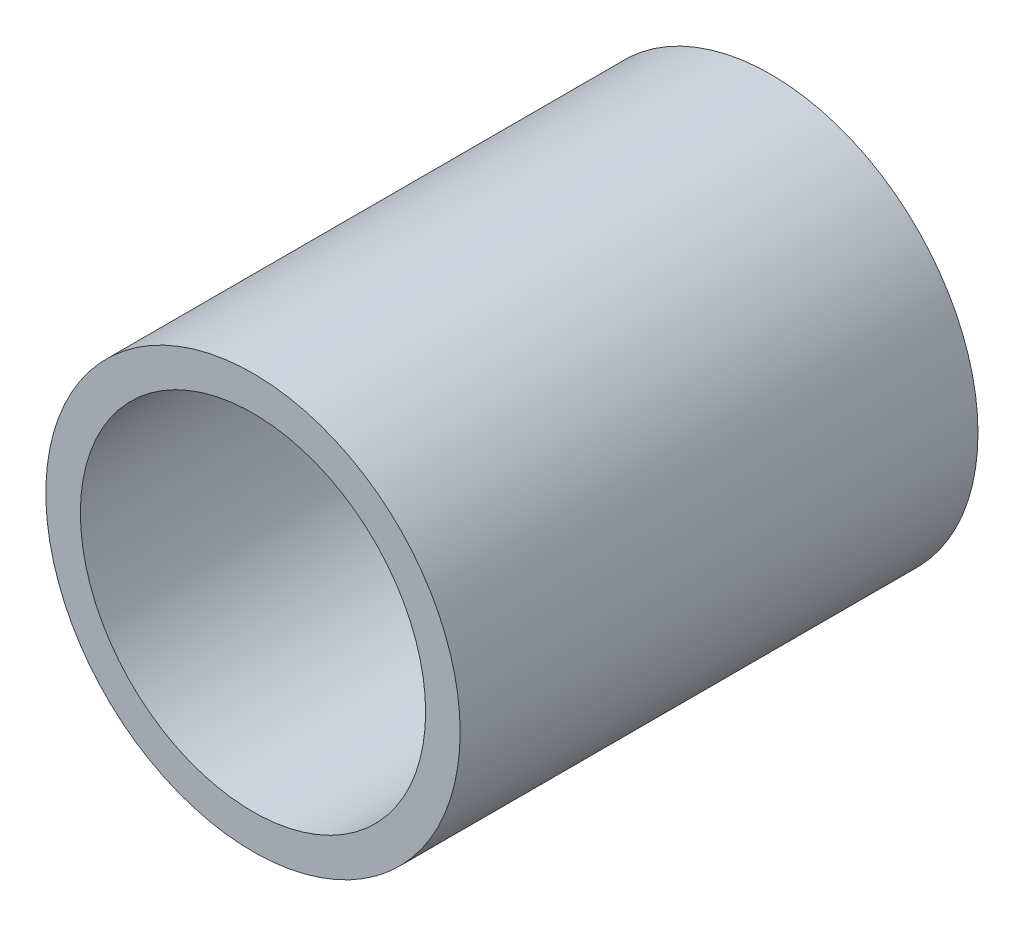
ISO-10303-21;
HEADER;
FILE_DESCRIPTION(('STEP AP214'),'2;1');
FILE_NAME('part.step','',(''),(''),'','','');
FILE_SCHEMA(('AUTOMOTIVE_DESIGN { 1 0 10303 214 1 1 1 1 }'));
ENDSEC;
DATA;
#1=APPLICATION_CONTEXT('core data for automotive mechanical design processes');
#2=APPLICATION_PROTOCOL_DEFINITION('international standard','automotive_design',2000,#1);
#3=PRODUCT_CONTEXT('',#1,'mechanical');
#4=PRODUCT('Part','Part','',(#3));
#5=PRODUCT_RELATED_PRODUCT_CATEGORY('part','',(#4));
#6=PRODUCT_DEFINITION_FORMATION('','',#4);
#7=PRODUCT_DEFINITION_CONTEXT('part definition',#1,'design');
#8=PRODUCT_DEFINITION('design','',#6,#7);
#9=PRODUCT_DEFINITION_SHAPE('','',#8);
#10=(LENGTH_UNIT() NAMED_UNIT(*) SI_UNIT(.MILLI.,.METRE.));
#11=(NAMED_UNIT(*) PLANE_ANGLE_UNIT() SI_UNIT($,.RADIAN.));
#12=(NAMED_UNIT(*) SI_UNIT($,.STERADIAN.) SOLID_ANGLE_UNIT());
#13=UNCERTAINTY_MEASURE_WITH_UNIT(LENGTH_MEASURE(1.E-05),#10,'distance_accuracy_value','');
#14=(GEOMETRIC_REPRESENTATION_CONTEXT(3) GLOBAL_UNCERTAINTY_ASSIGNED_CONTEXT((#13)) GLOBAL_UNIT_ASSIGNED_CONTEXT((#10,
#11,#12)) REPRESENTATION_CONTEXT('',''));
#15=CARTESIAN_POINT('',(0.,0.,0.));
#16=DIRECTION('',(0.,0.,1.));
#17=DIRECTION('',(1.,0.,0.));
#18=AXIS2_PLACEMENT_3D('',#15,#16,#17);
#19=CARTESIAN_POINT('',(0.,0.,15.));
#20=DIRECTION('',(0.,0.,1.));
#21=DIRECTION('',(1.,0.,0.));
#22=AXIS2_PLACEMENT_3D('',#19,#20,#21);
#23=PLANE('',#22);
#24=CARTESIAN_POINT('',(0.,0.,15.));
#25=DIRECTION('',(0.,0.,1.));
#26=DIRECTION('',(1.,0.,0.));
#27=AXIS2_PLACEMENT_3D('',#24,#25,#26);
#28=CIRCLE('',#27,6.);
#29=CARTESIAN_POINT('',(6.,0.,15.));
#30=VERTEX_POINT('',#29);
#31=EDGE_CURVE('E10',#30,#30,#28,.T.);
#32=ORIENTED_EDGE('',*,*,#31,.T.);
#33=EDGE_LOOP('',(#32));
#34=FACE_BOUND('',#33,.T.);
#35=CARTESIAN_POINT('',(0.,0.,15.));
#36=DIRECTION('',(0.,0.,1.));
#37=DIRECTION('',(1.,0.,0.));
#38=AXIS2_PLACEMENT_3D('',#35,#36,#37);
#39=CIRCLE('',#38,5.);
#40=CARTESIAN_POINT('',(5.,0.,15.));
#41=VERTEX_POINT('',#40);
#42=EDGE_CURVE('E50',#41,#41,#39,.T.);
#43=ORIENTED_EDGE('',*,*,#42,.F.);
#44=EDGE_LOOP('',(#43));
#45=FACE_BOUND('',#44,.T.);
#46=ADVANCED_FACE('F37',(#34,#45),#23,.T.);
#47=CARTESIAN_POINT('',(0.,0.,0.));
#48=DIRECTION('',(0.,0.,1.));
#49=DIRECTION('',(1.,0.,0.));
#50=AXIS2_PLACEMENT_3D('',#47,#48,#49);
#51=PLANE('',#50);
#52=CARTESIAN_POINT('',(0.,0.,0.));
#53=DIRECTION('',(0.,0.,1.));
#54=DIRECTION('',(1.,0.,0.));
#55=AXIS2_PLACEMENT_3D('',#52,#53,#54);
#56=CIRCLE('',#55,6.);
#57=CARTESIAN_POINT('',(6.,0.,0.));
#58=VERTEX_POINT('',#57);
#59=EDGE_CURVE('E41',#58,#58,#56,.T.);
#60=ORIENTED_EDGE('',*,*,#59,.F.);
#61=EDGE_LOOP('',(#60));
#62=FACE_BOUND('',#61,.T.);
#63=CARTESIAN_POINT('',(0.,0.,0.));
#64=DIRECTION('',(0.,0.,1.));
#65=DIRECTION('',(1.,0.,0.));
#66=AXIS2_PLACEMENT_3D('',#63,#64,#65);
#67=CIRCLE('',#66,5.);
#68=CARTESIAN_POINT('',(5.,0.,0.));
#69=VERTEX_POINT('',#68);
#70=EDGE_CURVE('E52',#69,#69,#67,.T.);
#71=ORIENTED_EDGE('',*,*,#70,.T.);
#72=EDGE_LOOP('',(#71));
#73=FACE_BOUND('',#72,.T.);
#74=ADVANCED_FACE('F64',(#62,#73),#51,.F.);
#75=CARTESIAN_POINT('',(0.,0.,15.));
#76=DIRECTION('',(0.,0.,-1.));
#77=DIRECTION('',(-1.,0.,0.));
#78=AXIS2_PLACEMENT_3D('',#75,#76,#77);
#79=CYLINDRICAL_SURFACE('',#78,6.);
#80=ORIENTED_EDGE('',*,*,#31,.F.);
#81=EDGE_LOOP('',(#80));
#82=FACE_BOUND('',#81,.T.);
#83=ORIENTED_EDGE('',*,*,#59,.T.);
#84=EDGE_LOOP('',(#83));
#85=FACE_BOUND('',#84,.T.);
#86=ADVANCED_FACE('F39',(#82,#85),#79,.T.);
#87=CARTESIAN_POINT('',(0.,0.,15.));
#88=DIRECTION('',(0.,0.,-1.));
#89=DIRECTION('',(-1.,0.,0.));
#90=AXIS2_PLACEMENT_3D('',#87,#88,#89);
#91=CYLINDRICAL_SURFACE('',#90,5.);
#92=ORIENTED_EDGE('',*,*,#42,.T.);
#93=EDGE_LOOP('',(#92));
#94=FACE_BOUND('',#93,.T.);
#95=ORIENTED_EDGE('',*,*,#70,.F.);
#96=EDGE_LOOP('',(#95));
#97=FACE_BOUND('',#96,.T.);
#98=ADVANCED_FACE('F60',(#94,#97),#91,.F.);
#99=CLOSED_SHELL('',(#46,#74,#86,#98));
#100=MANIFOLD_SOLID_BREP('B2',#99);
#101=ADVANCED_BREP_SHAPE_REPRESENTATION('',(#18,#100),#14);
#102=SHAPE_DEFINITION_REPRESENTATION(#9,#101);
ENDSEC;
END-ISO-10303-21;
